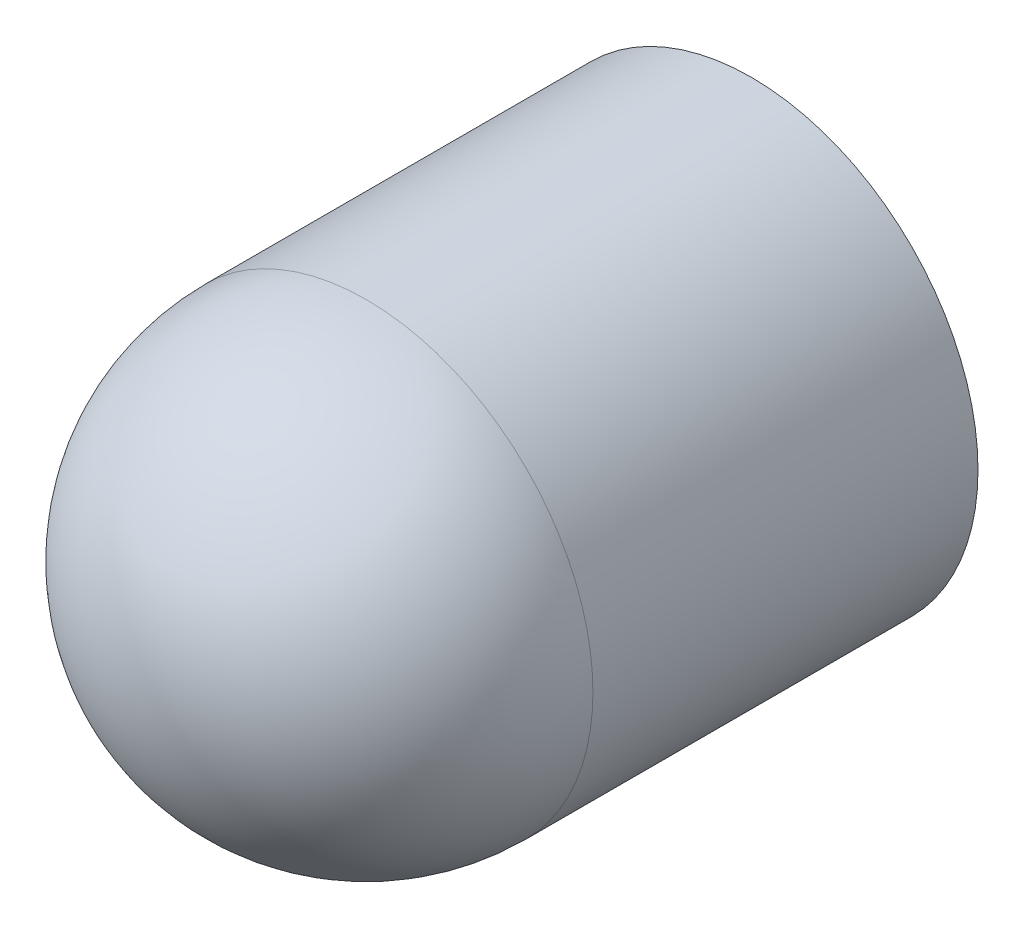
ISO-10303-21;
HEADER;
FILE_DESCRIPTION(('STEP AP214'),'2;1');
FILE_NAME('part.step','',(''),(''),'','','');
FILE_SCHEMA(('AUTOMOTIVE_DESIGN { 1 0 10303 214 1 1 1 1 }'));
ENDSEC;
DATA;
#1=APPLICATION_CONTEXT('core data for automotive mechanical design processes');
#2=APPLICATION_PROTOCOL_DEFINITION('international standard','automotive_design',2000,#1);
#3=PRODUCT_CONTEXT('',#1,'mechanical');
#4=PRODUCT('Part','Part','',(#3));
#5=PRODUCT_RELATED_PRODUCT_CATEGORY('part','',(#4));
#6=PRODUCT_DEFINITION_FORMATION('','',#4);
#7=PRODUCT_DEFINITION_CONTEXT('part definition',#1,'design');
#8=PRODUCT_DEFINITION('design','',#6,#7);
#9=PRODUCT_DEFINITION_SHAPE('','',#8);
#10=(LENGTH_UNIT() NAMED_UNIT(*) SI_UNIT(.MILLI.,.METRE.));
#11=(NAMED_UNIT(*) PLANE_ANGLE_UNIT() SI_UNIT($,.RADIAN.));
#12=(NAMED_UNIT(*) SI_UNIT($,.STERADIAN.) SOLID_ANGLE_UNIT());
#13=UNCERTAINTY_MEASURE_WITH_UNIT(LENGTH_MEASURE(1.E-05),#10,'distance_accuracy_value','');
#14=(GEOMETRIC_REPRESENTATION_CONTEXT(3) GLOBAL_UNCERTAINTY_ASSIGNED_CONTEXT((#13)) GLOBAL_UNIT_ASSIGNED_CONTEXT((#10,
#11,#12)) REPRESENTATION_CONTEXT('',''));
#15=CARTESIAN_POINT('',(0.,0.,0.));
#16=DIRECTION('',(0.,0.,1.));
#17=DIRECTION('',(1.,0.,0.));
#18=AXIS2_PLACEMENT_3D('',#15,#16,#17);
#19=CARTESIAN_POINT('',(0.,0.,5.43298281280235));
#20=DIRECTION('',(0.,0.,-1.));
#21=DIRECTION('',(-1.,0.,0.));
#22=AXIS2_PLACEMENT_3D('',#19,#20,#21);
#23=CYLINDRICAL_SURFACE('',#22,1.2);
#24=CARTESIAN_POINT('',(0.,0.,0.));
#25=DIRECTION('',(0.,0.,1.));
#26=DIRECTION('',(1.,0.,0.));
#27=AXIS2_PLACEMENT_3D('',#24,#25,#26);
#28=CIRCLE('',#27,1.2);
#29=CARTESIAN_POINT('',(-1.2,0.,0.));
#30=VERTEX_POINT('',#29);
#31=EDGE_CURVE('E36',#30,#30,#28,.T.);
#32=CARTESIAN_POINT('',(0.,0.,2.03887026310692));
#33=DIRECTION('',(0.,0.,1.));
#34=DIRECTION('',(1.,0.,0.));
#35=AXIS2_PLACEMENT_3D('',#32,#33,#34);
#36=CIRCLE('',#35,1.2);
#37=CARTESIAN_POINT('',(-1.2,0.,2.03887026310692));
#38=VERTEX_POINT('',#37);
#39=EDGE_CURVE('E10',#38,#38,#36,.T.);
#40=CARTESIAN_POINT('',(-1.2,0.,0.));
#41=CARTESIAN_POINT('',(-1.2,0.,0.0212382319073638));
#42=CARTESIAN_POINT('',(-1.2,0.,0.0424764638147276));
#43=CARTESIAN_POINT('',(-1.2,0.,0.0849529276294551));
#44=CARTESIAN_POINT('',(-1.2,0.,0.106191159536819));
#45=CARTESIAN_POINT('',(-1.2,0.,0.148667623351546));
#46=CARTESIAN_POINT('',(-1.2,0.,0.16990585525891));
#47=CARTESIAN_POINT('',(-1.2,0.,0.212382319073638));
#48=CARTESIAN_POINT('',(-1.2,0.,0.233620550981002));
#49=CARTESIAN_POINT('',(-1.2,0.,0.276097014795729));
#50=CARTESIAN_POINT('',(-1.2,0.,0.297335246703092));
#51=CARTESIAN_POINT('',(-1.2,0.,0.33981171051782));
#52=CARTESIAN_POINT('',(-1.2,0.,0.361049942425183));
#53=CARTESIAN_POINT('',(-1.2,0.,0.403526406239911));
#54=CARTESIAN_POINT('',(-1.2,0.,0.424764638147275));
#55=CARTESIAN_POINT('',(-1.2,0.,0.467241101962002));
#56=CARTESIAN_POINT('',(-1.2,0.,0.488479333869366));
#57=CARTESIAN_POINT('',(-1.2,0.,0.530955797684094));
#58=CARTESIAN_POINT('',(-1.2,0.,0.552194029591458));
#59=CARTESIAN_POINT('',(-1.2,0.,0.594670493406185));
#60=CARTESIAN_POINT('',(-1.2,0.,0.615908725313549));
#61=CARTESIAN_POINT('',(-1.2,0.,0.658385189128276));
#62=CARTESIAN_POINT('',(-1.2,0.,0.67962342103564));
#63=CARTESIAN_POINT('',(-1.2,0.,0.722099884850368));
#64=CARTESIAN_POINT('',(-1.2,0.,0.743338116757732));
#65=CARTESIAN_POINT('',(-1.2,0.,0.785814580572459));
#66=CARTESIAN_POINT('',(-1.2,0.,0.807052812479823));
#67=CARTESIAN_POINT('',(-1.2,0.,0.849529276294551));
#68=CARTESIAN_POINT('',(-1.2,0.,0.870767508201914));
#69=CARTESIAN_POINT('',(-1.2,0.,0.913243972016642));
#70=CARTESIAN_POINT('',(-1.2,0.,0.934482203924006));
#71=CARTESIAN_POINT('',(-1.2,0.,0.976958667738733));
#72=CARTESIAN_POINT('',(-1.2,0.,0.998196899646096));
#73=CARTESIAN_POINT('',(-1.2,0.,1.04067336346082));
#74=CARTESIAN_POINT('',(-1.2,0.,1.06191159536819));
#75=CARTESIAN_POINT('',(-1.2,0.,1.10438805918292));
#76=CARTESIAN_POINT('',(-1.2,0.,1.12562629109028));
#77=CARTESIAN_POINT('',(-1.2,0.,1.16810275490501));
#78=CARTESIAN_POINT('',(-1.2,0.,1.18934098681237));
#79=CARTESIAN_POINT('',(-1.2,0.,1.2318174506271));
#80=CARTESIAN_POINT('',(-1.2,0.,1.25305568253446));
#81=CARTESIAN_POINT('',(-1.2,0.,1.29553214634919));
#82=CARTESIAN_POINT('',(-1.2,0.,1.31677037825655));
#83=CARTESIAN_POINT('',(-1.2,0.,1.35924684207128));
#84=CARTESIAN_POINT('',(-1.2,0.,1.38048507397864));
#85=CARTESIAN_POINT('',(-1.2,0.,1.42296153779337));
#86=CARTESIAN_POINT('',(-1.2,0.,1.44419976970074));
#87=CARTESIAN_POINT('',(-1.2,0.,1.48667623351546));
#88=CARTESIAN_POINT('',(-1.2,0.,1.50791446542283));
#89=CARTESIAN_POINT('',(-1.2,0.,1.55039092923755));
#90=CARTESIAN_POINT('',(-1.2,0.,1.57162916114492));
#91=CARTESIAN_POINT('',(-1.2,0.,1.61410562495965));
#92=CARTESIAN_POINT('',(-1.2,0.,1.63534385686701));
#93=CARTESIAN_POINT('',(-1.2,0.,1.67782032068174));
#94=CARTESIAN_POINT('',(-1.2,0.,1.6990585525891));
#95=CARTESIAN_POINT('',(-1.2,0.,1.74153501640383));
#96=CARTESIAN_POINT('',(-1.2,0.,1.76277324831119));
#97=CARTESIAN_POINT('',(-1.2,0.,1.80524971212592));
#98=CARTESIAN_POINT('',(-1.2,0.,1.82648794403328));
#99=CARTESIAN_POINT('',(-1.2,0.,1.86896440784801));
#100=CARTESIAN_POINT('',(-1.2,0.,1.89020263975537));
#101=CARTESIAN_POINT('',(-1.2,0.,1.9326791035701));
#102=CARTESIAN_POINT('',(-1.2,0.,1.95391733547747));
#103=CARTESIAN_POINT('',(-1.2,0.,1.99639379929219));
#104=CARTESIAN_POINT('',(-1.2,0.,2.01763203119956));
#105=CARTESIAN_POINT('',(-1.2,0.,2.03887026310692));
#106=B_SPLINE_CURVE_WITH_KNOTS('',3,(#40,#41,#42,#43,#44,#45,#46,#47,#48,#49,#50,#51,#52,#53,
#54,#55,#56,#57,#58,#59,#60,#61,#62,#63,#64,#65,#66,#67,#68,#69,#70,#71,#72,#73,#74,#75,#76,#77,
#78,#79,#80,#81,#82,#83,#84,#85,#86,#87,#88,#89,#90,#91,#92,#93,#94,#95,#96,#97,#98,#99,#100,
#101,#102,#103,#104,#105),.UNSPECIFIED.,.F.,.F.,(4,2,2,2,2,2,2,2,2,2,2,2,2,2,2,2,2,2,2,2,2,2,2,
2,2,2,2,2,2,2,2,2,4),(0.,0.0637146957220913,0.127429391444183,0.191144087166274,
0.254858782888365,0.318573478610456,0.382288174332547,0.446002870054639,0.50971756577673,
0.573432261498821,0.637146957220913,0.700861652943004,0.764576348665095,0.828291044387187,
0.892005740109278,0.955720435831369,1.01943513155346,1.08314982727555,1.14686452299764,
1.21057921871973,1.27429391444183,1.33800861016392,1.40172330588601,1.4654380016081,
1.52915269733019,1.59286739305228,1.65658208877437,1.72029678449646,1.78401148021856,
1.84772617594065,1.91144087166274,1.97515556738483,2.03887026310692),.UNSPECIFIED.);
#107=EDGE_CURVE('BSEAM30',#30,#38,#106,.T.);
#108=ORIENTED_EDGE('',*,*,#31,.T.);
#109=ORIENTED_EDGE('',*,*,#39,.F.);
#110=ORIENTED_EDGE('',*,*,#107,.T.);
#111=ORIENTED_EDGE('',*,*,#107,.F.);
#112=EDGE_LOOP('',(#108,#110,#109,#111));
#113=FACE_BOUND('',#112,.T.);
#114=ADVANCED_FACE('F30',(#113),#23,.T.);
#115=CARTESIAN_POINT('',(0.,0.,0.));
#116=DIRECTION('',(0.,0.,1.));
#117=DIRECTION('',(1.,0.,0.));
#118=AXIS2_PLACEMENT_3D('',#115,#116,#117);
#119=PLANE('',#118);
#120=ORIENTED_EDGE('',*,*,#31,.F.);
#121=EDGE_LOOP('',(#120));
#122=FACE_BOUND('',#121,.T.);
#123=ADVANCED_FACE('F44',(#122),#119,.F.);
#124=CARTESIAN_POINT('',(0.,0.,2.03887026310692));
#125=DIRECTION('',(0.,0.,-1.));
#126=DIRECTION('',(1.,0.,0.));
#127=AXIS2_PLACEMENT_3D('',#124,#125,#126);
#128=SPHERICAL_SURFACE('',#127,1.2);
#129=ORIENTED_EDGE('',*,*,#39,.T.);
#130=EDGE_LOOP('',(#129));
#131=FACE_BOUND('',#130,.T.);
#132=ADVANCED_FACE('F46',(#131),#128,.T.);
#133=CLOSED_SHELL('',(#114,#123,#132));
#134=MANIFOLD_SOLID_BREP('B2',#133);
#135=ADVANCED_BREP_SHAPE_REPRESENTATION('',(#18,#134),#14);
#136=SHAPE_DEFINITION_REPRESENTATION(#9,#135);
ENDSEC;
END-ISO-10303-21;
